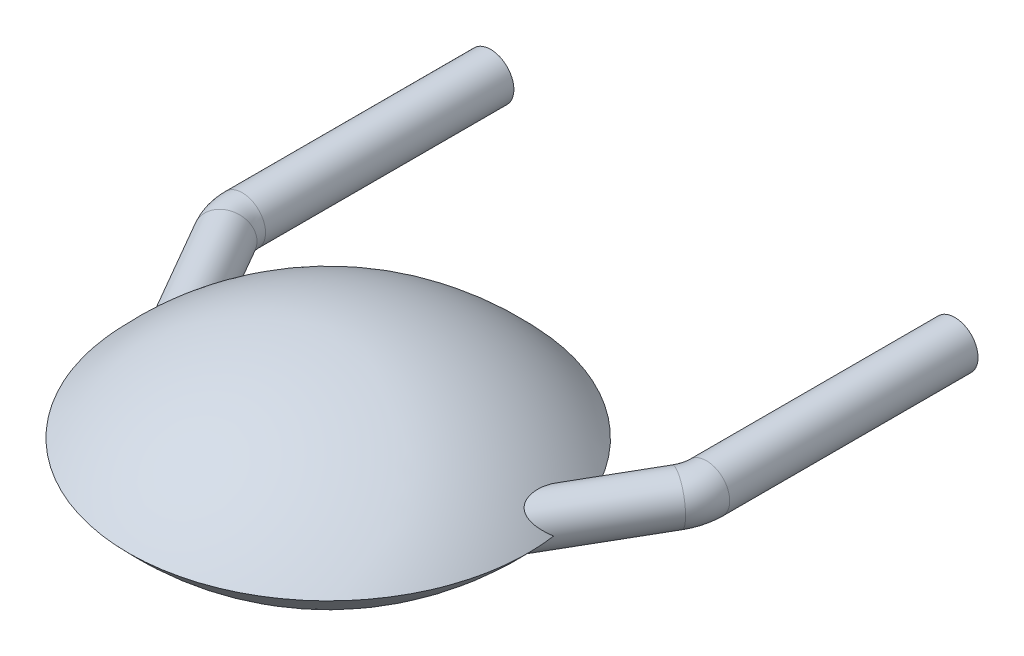
ISO-10303-21;
HEADER;
FILE_DESCRIPTION(('STEP AP214'),'2;1');
FILE_NAME('part.step','',(''),(''),'','','');
FILE_SCHEMA(('AUTOMOTIVE_DESIGN { 1 0 10303 214 1 1 1 1 }'));
ENDSEC;
DATA;
#1=APPLICATION_CONTEXT('core data for automotive mechanical design processes');
#2=APPLICATION_PROTOCOL_DEFINITION('international standard','automotive_design',2000,#1);
#3=PRODUCT_CONTEXT('',#1,'mechanical');
#4=PRODUCT('Part','Part','',(#3));
#5=PRODUCT_RELATED_PRODUCT_CATEGORY('part','',(#4));
#6=PRODUCT_DEFINITION_FORMATION('','',#4);
#7=PRODUCT_DEFINITION_CONTEXT('part definition',#1,'design');
#8=PRODUCT_DEFINITION('design','',#6,#7);
#9=PRODUCT_DEFINITION_SHAPE('','',#8);
#10=(LENGTH_UNIT() NAMED_UNIT(*) SI_UNIT(.MILLI.,.METRE.));
#11=(NAMED_UNIT(*) PLANE_ANGLE_UNIT() SI_UNIT($,.RADIAN.));
#12=(NAMED_UNIT(*) SI_UNIT($,.STERADIAN.) SOLID_ANGLE_UNIT());
#13=UNCERTAINTY_MEASURE_WITH_UNIT(LENGTH_MEASURE(1.E-05),#10,'distance_accuracy_value','');
#14=(GEOMETRIC_REPRESENTATION_CONTEXT(3) GLOBAL_UNCERTAINTY_ASSIGNED_CONTEXT((#13)) GLOBAL_UNIT_ASSIGNED_CONTEXT((#10,
#11,#12)) REPRESENTATION_CONTEXT('',''));
#15=CARTESIAN_POINT('',(0.,0.,0.));
#16=DIRECTION('',(0.,0.,1.));
#17=DIRECTION('',(1.,0.,0.));
#18=AXIS2_PLACEMENT_3D('',#15,#16,#17);
#19=CARTESIAN_POINT('',(23.,-31.25,-2.));
#20=DIRECTION('',(0.,0.,-1.));
#21=DIRECTION('',(-1.,0.,0.));
#22=AXIS2_PLACEMENT_3D('',#19,#20,#21);
#23=PLANE('',#22);
#24=CARTESIAN_POINT('',(23.,-31.,-2.));
#25=DIRECTION('',(0.,0.,-1.));
#26=DIRECTION('',(-1.,0.,0.));
#27=AXIS2_PLACEMENT_3D('',#24,#25,#26);
#28=CIRCLE('',#27,0.25);
#29=CARTESIAN_POINT('',(22.75,-31.,-2.));
#30=VERTEX_POINT('',#29);
#31=EDGE_CURVE('E20',#30,#30,#28,.F.);
#32=ORIENTED_EDGE('',*,*,#31,.F.);
#33=EDGE_LOOP('',(#32));
#34=FACE_BOUND('',#33,.T.);
#35=ADVANCED_FACE('F17',(#34),#23,.T.);
#36=CARTESIAN_POINT('',(28.,-30.75,-2.));
#37=DIRECTION('',(0.,0.,-1.));
#38=DIRECTION('',(-1.,0.,0.));
#39=AXIS2_PLACEMENT_3D('',#36,#37,#38);
#40=PLANE('',#39);
#41=CARTESIAN_POINT('',(28.,-31.,-2.));
#42=DIRECTION('',(0.,0.,-1.));
#43=DIRECTION('',(-1.,0.,0.));
#44=AXIS2_PLACEMENT_3D('',#41,#42,#43);
#45=CIRCLE('',#44,0.25);
#46=CARTESIAN_POINT('',(27.75,-31.,-2.));
#47=VERTEX_POINT('',#46);
#48=EDGE_CURVE('E109',#47,#47,#45,.F.);
#49=ORIENTED_EDGE('',*,*,#48,.F.);
#50=EDGE_LOOP('',(#49));
#51=FACE_BOUND('',#50,.T.);
#52=ADVANCED_FACE('F131',(#51),#40,.T.);
#53=CARTESIAN_POINT('',(23.,-31.,-2.));
#54=DIRECTION('',(0.,0.,-1.));
#55=DIRECTION('',(-1.,0.,0.));
#56=AXIS2_PLACEMENT_3D('',#53,#54,#55);
#57=CYLINDRICAL_SURFACE('',#56,0.25);
#58=CARTESIAN_POINT('',(23.,-31.,0.675));
#59=DIRECTION('',(0.,0.,1.));
#60=DIRECTION('',(0.,-1.,0.));
#61=AXIS2_PLACEMENT_3D('',#58,#59,#60);
#62=CIRCLE('',#61,0.25);
#63=CARTESIAN_POINT('',(23.,-31.25,0.675));
#64=VERTEX_POINT('',#63);
#65=EDGE_CURVE('E107',#64,#64,#62,.F.);
#66=ORIENTED_EDGE('',*,*,#65,.T.);
#67=EDGE_LOOP('',(#66));
#68=FACE_BOUND('',#67,.T.);
#69=ORIENTED_EDGE('',*,*,#31,.T.);
#70=EDGE_LOOP('',(#69));
#71=FACE_BOUND('',#70,.T.);
#72=ADVANCED_FACE('F128',(#68,#71),#57,.T.);
#73=CARTESIAN_POINT('',(28.,-31.,-2.));
#74=DIRECTION('',(0.,0.,-1.));
#75=DIRECTION('',(-1.,0.,0.));
#76=AXIS2_PLACEMENT_3D('',#73,#74,#75);
#77=CYLINDRICAL_SURFACE('',#76,0.25);
#78=CARTESIAN_POINT('',(28.,-31.,0.675));
#79=DIRECTION('',(0.,0.,1.));
#80=DIRECTION('',(0.,1.,0.));
#81=AXIS2_PLACEMENT_3D('',#78,#79,#80);
#82=CIRCLE('',#81,0.25);
#83=CARTESIAN_POINT('',(28.,-30.75,0.675));
#84=VERTEX_POINT('',#83);
#85=EDGE_CURVE('E91',#84,#84,#82,.F.);
#86=ORIENTED_EDGE('',*,*,#85,.T.);
#87=EDGE_LOOP('',(#86));
#88=FACE_BOUND('',#87,.T.);
#89=ORIENTED_EDGE('',*,*,#48,.T.);
#90=EDGE_LOOP('',(#89));
#91=FACE_BOUND('',#90,.T.);
#92=ADVANCED_FACE('F102',(#88,#91),#77,.T.);
#93=CARTESIAN_POINT('',(23.5,-31.,0.675));
#94=DIRECTION('',(0.,-1.,0.));
#95=DIRECTION('',(-1.,0.,0.));
#96=AXIS2_PLACEMENT_3D('',#93,#94,#95);
#97=TOROIDAL_SURFACE('',#96,0.5,0.25);
#98=ORIENTED_EDGE('',*,*,#65,.F.);
#99=EDGE_LOOP('',(#98));
#100=FACE_BOUND('',#99,.T.);
#101=CARTESIAN_POINT('',(23.066987298108,-31.,0.925));
#102=DIRECTION('',(-0.50000000000019,0.,-0.866025403784329));
#103=DIRECTION('',(-0.866025403784329,0.,0.50000000000019));
#104=AXIS2_PLACEMENT_3D('',#101,#102,#103);
#105=CIRCLE('',#104,0.25);
#106=CARTESIAN_POINT('',(22.8504809471619,-31.,1.05000000000005));
#107=VERTEX_POINT('',#106);
#108=EDGE_CURVE('E51',#107,#107,#105,.F.);
#109=ORIENTED_EDGE('',*,*,#108,.F.);
#110=EDGE_LOOP('',(#109));
#111=FACE_BOUND('',#110,.T.);
#112=ADVANCED_FACE('F98',(#100,#111),#97,.T.);
#113=CARTESIAN_POINT('',(27.5,-31.,0.675));
#114=DIRECTION('',(0.,1.,0.));
#115=DIRECTION('',(1.,0.,0.));
#116=AXIS2_PLACEMENT_3D('',#113,#114,#115);
#117=TOROIDAL_SURFACE('',#116,0.5,0.25);
#118=ORIENTED_EDGE('',*,*,#85,.F.);
#119=EDGE_LOOP('',(#118));
#120=FACE_BOUND('',#119,.T.);
#121=CARTESIAN_POINT('',(27.933012701892,-31.,0.925));
#122=DIRECTION('',(0.50000000000019,0.,-0.866025403784329));
#123=DIRECTION('',(-0.866025403784329,0.,-0.50000000000019));
#124=AXIS2_PLACEMENT_3D('',#121,#122,#123);
#125=CIRCLE('',#124,0.25);
#126=CARTESIAN_POINT('',(27.7165063509459,-31.,0.799999999999953));
#127=VERTEX_POINT('',#126);
#128=EDGE_CURVE('E50',#127,#127,#125,.F.);
#129=ORIENTED_EDGE('',*,*,#128,.F.);
#130=EDGE_LOOP('',(#129));
#131=FACE_BOUND('',#130,.T.);
#132=ADVANCED_FACE('F95',(#120,#131),#117,.T.);
#133=CARTESIAN_POINT('',(23.066987298108,-31.,0.925));
#134=DIRECTION('',(-0.50000000000019,0.,-0.866025403784329));
#135=DIRECTION('',(-0.866025403784329,0.,0.50000000000019));
#136=AXIS2_PLACEMENT_3D('',#133,#134,#135);
#137=CYLINDRICAL_SURFACE('',#136,0.25);
#138=CARTESIAN_POINT('',(23.5716838145196,-30.9999999999976,1.29916000882768));
#139=CARTESIAN_POINT('',(23.5774601766791,-30.9894434738567,1.30918239003158));
#140=CARTESIAN_POINT('',(23.5828108659559,-30.979220630234,1.3197681064508));
#141=CARTESIAN_POINT('',(23.592746279409,-30.9594575074187,1.34185503197646));
#142=CARTESIAN_POINT('',(23.5973324911761,-30.9499159237607,1.35335439724459));
#143=CARTESIAN_POINT('',(23.6100557173039,-30.9223783802168,1.38883785932953));
#144=CARTESIAN_POINT('',(23.6172195178193,-30.9053521436496,1.41392328078561));
#145=CARTESIAN_POINT('',(23.6325175301564,-30.8658849986947,1.47925777517468));
#146=CARTESIAN_POINT('',(23.6393178885034,-30.8450460864817,1.52077201062532));
#147=CARTESIAN_POINT('',(23.648996865941,-30.8089126909544,1.606785274381));
#148=CARTESIAN_POINT('',(23.6518563469068,-30.7936455273878,1.65129777503575));
#149=CARTESIAN_POINT('',(23.6531843613049,-30.7732269072097,1.72716896213327));
#150=CARTESIAN_POINT('',(23.6527829982239,-30.7664001156551,1.75806910985283));
#151=CARTESIAN_POINT('',(23.6497115700061,-30.7559549699982,1.8201960418939));
#152=CARTESIAN_POINT('',(23.6470539330635,-30.7523192612047,1.85142011308575));
#153=CARTESIAN_POINT('',(23.6408481774983,-30.7501275655035,1.89594436526071));
#154=CARTESIAN_POINT('',(23.6386633066418,-30.7498592545624,1.90935151637289));
#155=CARTESIAN_POINT('',(23.6334826955446,-30.7502843637098,1.93598562599727));
#156=CARTESIAN_POINT('',(23.6304880400283,-30.7509765023428,1.94921280087489));
#157=CARTESIAN_POINT('',(23.6233579054657,-30.7536028845258,1.9754936937176));
#158=CARTESIAN_POINT('',(23.6192041095652,-30.7555577956726,1.98854076660759));
#159=CARTESIAN_POINT('',(23.6093860597141,-30.7611359844498,2.01363177791909));
#160=CARTESIAN_POINT('',(23.6037319627004,-30.764748158157,2.02568177239951));
#161=CARTESIAN_POINT('',(23.5906440927888,-30.7740369705702,2.04715636895737));
#162=CARTESIAN_POINT('',(23.5833123718128,-30.7796024598458,2.05668146611759));
#163=CARTESIAN_POINT('',(23.5709404165737,-30.7895844616091,2.06818862762317));
#164=CARTESIAN_POINT('',(23.566559659586,-30.7932083971439,2.07157162682305));
#165=CARTESIAN_POINT('',(23.5574749771692,-30.8008975298499,2.07721472389281));
#166=CARTESIAN_POINT('',(23.5527710985493,-30.8049626631558,2.07947498402033));
#167=CARTESIAN_POINT('',(23.5393488607174,-30.8167883829376,2.08415878303395));
#168=CARTESIAN_POINT('',(23.5304507353933,-30.8248865705635,2.08524548427299));
#169=CARTESIAN_POINT('',(23.514876529338,-30.8394485216565,2.08443352459922));
#170=CARTESIAN_POINT('',(23.5081254694529,-30.8458992675567,2.08311259851742));
#171=CARTESIAN_POINT('',(23.4949570690765,-30.8587216171957,2.07907513862098));
#172=CARTESIAN_POINT('',(23.4885406124092,-30.8650929805379,2.07635509634145));
#173=CARTESIAN_POINT('',(23.4709949416565,-30.8828308934959,2.0672602591048));
#174=CARTESIAN_POINT('',(23.4603066752815,-30.8940178539172,2.05971627682202));
#175=CARTESIAN_POINT('',(23.4400571285355,-30.9158911760848,2.04262047432083));
#176=CARTESIAN_POINT('',(23.4305011653482,-30.9265750441903,2.03305972512755));
#177=CARTESIAN_POINT('',(23.4119101946357,-30.9480591366764,2.01204619889605));
#178=CARTESIAN_POINT('',(23.4029315574867,-30.9588342403125,2.00051892560664));
#179=CARTESIAN_POINT('',(23.386113862992,-30.979795776747,1.97653612190643));
#180=CARTESIAN_POINT('',(23.3782602511313,-30.9899884540942,1.96409635781548));
#181=CARTESIAN_POINT('',(23.3708496305074,-30.9999999999975,1.95130499822168));
#182=B_SPLINE_CURVE_WITH_KNOTS('',3,(#138,#139,#140,#141,#142,#143,#144,#145,#146,#147,#148,
#149,#150,#151,#152,#153,#154,#155,#156,#157,#158,#159,#160,#161,#162,#163,#164,#165,#166,#167,
#168,#169,#170,#171,#172,#173,#174,#175,#176,#177,#178,#179,#180,#181),.UNSPECIFIED.,.F.,.F.,(4,
2,2,2,2,2,2,2,2,2,2,2,2,2,2,2,2,2,2,2,2,4),(0.,0.0469297268758645,0.093767039666413,
0.186918712773409,0.327066799423388,0.467893118612538,0.562667830135627,0.656923857782774,
0.697641576665213,0.738305021166334,0.779651464183061,0.820724836454615,0.859763250813787,
0.879498823201881,0.899231542585361,0.93486936662997,0.963041108101063,0.991283840774755,
1.04264171008501,1.09423192015922,1.14862039353849,1.20222527925137),.UNSPECIFIED.);
#183=CARTESIAN_POINT('',(23.5716838145206,-30.9999999999963,1.29916000882837));
#184=VERTEX_POINT('',#183);
#185=CARTESIAN_POINT('',(23.3708496305082,-30.9999999999961,1.95130499822308));
#186=VERTEX_POINT('',#185);
#187=EDGE_CURVE('E43',#184,#186,#182,.T.);
#188=ORIENTED_EDGE('',*,*,#187,.F.);
#189=CARTESIAN_POINT('',(23.370849630509,-30.9999999999947,1.95130499822448));
#190=CARTESIAN_POINT('',(23.3762704914257,-31.0073260291793,1.9606834434227));
#191=CARTESIAN_POINT('',(23.3819319959003,-31.0147507090038,1.96985535314893));
#192=CARTESIAN_POINT('',(23.3937931162556,-31.0298469541461,1.9877033124474));
#193=CARTESIAN_POINT('',(23.3999946721842,-31.0375193415481,1.99637737157592));
#194=CARTESIAN_POINT('',(23.4130203687763,-31.0531874857876,2.01316206446949));
#195=CARTESIAN_POINT('',(23.4198503466259,-31.0611857867682,2.02126585051422));
#196=CARTESIAN_POINT('',(23.4341222531439,-31.0774518786172,2.03659777519217));
#197=CARTESIAN_POINT('',(23.4415632102891,-31.0857192294964,2.04382726046125));
#198=CARTESIAN_POINT('',(23.4549355110937,-31.1001906211907,2.05522258355374));
#199=CARTESIAN_POINT('',(23.4607007866916,-31.106319019691,2.05967743562222));
#200=CARTESIAN_POINT('',(23.4726135007689,-31.1187473850408,2.06778114159423));
#201=CARTESIAN_POINT('',(23.4787609569798,-31.1250473598431,2.07142995806566));
#202=CARTESIAN_POINT('',(23.4915175305904,-31.1378738463305,2.07767290536923));
#203=CARTESIAN_POINT('',(23.4981309782167,-31.1444020864909,2.08025500776712));
#204=CARTESIAN_POINT('',(23.5117121637186,-31.1575380086699,2.08386891955295));
#205=CARTESIAN_POINT('',(23.5186791054384,-31.1641454886267,2.08490406565989));
#206=CARTESIAN_POINT('',(23.5303258137975,-31.1749471062334,2.08489207609271));
#207=CARTESIAN_POINT('',(23.534962814526,-31.1791851761192,2.0844415263007));
#208=CARTESIAN_POINT('',(23.5441810682798,-31.1874756861167,2.08252149191467));
#209=CARTESIAN_POINT('',(23.5487624310105,-31.1915285603762,2.08105453613206));
#210=CARTESIAN_POINT('',(23.5577541398852,-31.1993395264546,2.07704687319156));
#211=CARTESIAN_POINT('',(23.5621634373595,-31.2030959211874,2.07450045094904));
#212=CARTESIAN_POINT('',(23.5706404610701,-31.2101671943634,2.0684208546806));
#213=CARTESIAN_POINT('',(23.5747079985558,-31.2134818294119,2.06488713998262));
#214=CARTESIAN_POINT('',(23.5875743622429,-31.2237055414432,2.05171666652548));
#215=CARTESIAN_POINT('',(23.595407967582,-31.229478145455,2.04024777326555));
#216=CARTESIAN_POINT('',(23.6073704709567,-31.2375800941341,2.01797260740955));
#217=CARTESIAN_POINT('',(23.6119298123824,-31.2403731203619,2.00751401016957));
#218=CARTESIAN_POINT('',(23.6199961188454,-31.2447962626931,1.98594265330505));
#219=CARTESIAN_POINT('',(23.6235008617729,-31.2464239331241,1.97482857061149));
#220=CARTESIAN_POINT('',(23.6288458552504,-31.2484350007752,1.95535341428606));
#221=CARTESIAN_POINT('',(23.6308797840109,-31.2490360696796,1.94706260744734));
#222=CARTESIAN_POINT('',(23.6345820785632,-31.2498179064455,1.93039798509434));
#223=CARTESIAN_POINT('',(23.6362511597378,-31.2499995036113,1.92202436629215));
#224=CARTESIAN_POINT('',(23.6407460155134,-31.2500009733514,1.89715005197041));
#225=CARTESIAN_POINT('',(23.6431422171635,-31.2493056154992,1.88057137589999));
#226=CARTESIAN_POINT('',(23.6470587271412,-31.246792810136,1.84739019654105));
#227=CARTESIAN_POINT('',(23.648577981277,-31.2449740175391,1.83078768852717));
#228=CARTESIAN_POINT('',(23.6520947928669,-31.2380508647447,1.78089673990654));
#229=CARTESIAN_POINT('',(23.6530192615169,-31.231484398354,1.74773329288159));
#230=CARTESIAN_POINT('',(23.6526212130362,-31.2114108884292,1.66726885221905));
#231=CARTESIAN_POINT('',(23.6500795927319,-31.1961036577616,1.62042874138108));
#232=CARTESIAN_POINT('',(23.640700633774,-31.1593664707263,1.52996486839545));
#233=CARTESIAN_POINT('',(23.633890159786,-31.1379752584451,1.48632288414947));
#234=CARTESIAN_POINT('',(23.6183420229703,-31.0973666263978,1.41804752079719));
#235=CARTESIAN_POINT('',(23.6110711712103,-31.0799288542045,1.39203616028012));
#236=CARTESIAN_POINT('',(23.598072975853,-31.0516392810598,1.35526053810852));
#237=CARTESIAN_POINT('',(23.5933730591969,-31.041818863107,1.34334086765456));
#238=CARTESIAN_POINT('',(23.5831623816106,-31.0214520499175,1.32046622093208));
#239=CARTESIAN_POINT('',(23.5776499369343,-31.0109041719652,1.30951332526754));
#240=CARTESIAN_POINT('',(23.5716838145214,-30.9999999999956,1.29916000883069));
#241=B_SPLINE_CURVE_WITH_KNOTS('',3,(#189,#190,#191,#192,#193,#194,#195,#196,#197,#198,#199,
#200,#201,#202,#203,#204,#205,#206,#207,#208,#209,#210,#211,#212,#213,#214,#215,#216,#217,#218,
#219,#220,#221,#222,#223,#224,#225,#226,#227,#228,#229,#230,#231,#232,#233,#234,#235,#236,#237,
#238,#239,#240),.UNSPECIFIED.,.F.,.F.,(4,2,2,2,2,2,2,2,2,2,2,2,2,2,2,2,2,2,2,2,2,2,2,2,2,4),(0.,
0.0392376098810692,0.0786224989494974,0.118419631433026,0.158154664136992,0.186683761257875,
0.215214182984627,0.244058071956325,0.272839655632403,0.291661969838005,0.31043762162438,
0.329313945017611,0.348200626003105,0.392399981500024,0.42752172097679,0.462716954291726,
0.488373172236839,0.513978623736206,0.56418746626216,0.614456540558949,0.715621079863322,
0.862990207242744,1.00944109920643,1.10555865709927,1.15392973094745,1.20240248798468),.UNSPECIFIED.);
#242=EDGE_CURVE('E53',#186,#184,#241,.T.);
#243=ORIENTED_EDGE('',*,*,#242,.F.);
#244=EDGE_LOOP('',(#188,#243));
#245=FACE_BOUND('',#244,.T.);
#246=ORIENTED_EDGE('',*,*,#108,.T.);
#247=EDGE_LOOP('',(#246));
#248=FACE_BOUND('',#247,.T.);
#249=ADVANCED_FACE('F54',(#245,#248),#137,.T.);
#250=CARTESIAN_POINT('',(25.5,-32.95789473684,2.25));
#251=DIRECTION('',(1.,0.,0.));
#252=DIRECTION('',(0.,0.,-1.));
#253=AXIS2_PLACEMENT_3D('',#250,#251,#252);
#254=SPHERICAL_SURFACE('',#253,2.907894736842);
#255=CARTESIAN_POINT('',(27.6291503694904,-30.999999999995,1.95130499822226));
#256=CARTESIAN_POINT('',(27.6360854649517,-30.999999999995,2.00072178155626));
#257=CARTESIAN_POINT('',(27.6412947100438,-30.999999999995,2.05037691776354));
#258=CARTESIAN_POINT('',(27.6482551419081,-30.999999999995,2.15001990106865));
#259=CARTESIAN_POINT('',(27.6500000148116,-30.999999999995,2.20000818935141));
#260=CARTESIAN_POINT('',(27.6499999820985,-30.999999999995,2.31040000216905));
#261=CARTESIAN_POINT('',(27.6474528778951,-30.999999999995,2.37080514608428));
#262=CARTESIAN_POINT('',(27.6372822926077,-30.999999999995,2.49119557091687));
#263=CARTESIAN_POINT('',(27.6296577482943,-30.999999999995,2.55118076123576));
#264=CARTESIAN_POINT('',(27.6093760094947,-30.999999999995,2.67034040925088));
#265=CARTESIAN_POINT('',(27.5967154405601,-30.999999999995,2.72951429576506));
#266=CARTESIAN_POINT('',(27.566448502121,-30.999999999995,2.84662045274802));
#267=CARTESIAN_POINT('',(27.5488379996646,-30.999999999995,2.90455164193352));
#268=CARTESIAN_POINT('',(27.4888066101061,-30.999999999995,3.07566359722195));
#269=CARTESIAN_POINT('',(27.4391461458836,-30.999999999995,3.18639452014764));
#270=CARTESIAN_POINT('',(27.321913939087,-30.999999999995,3.39793439756679));
#271=CARTESIAN_POINT('',(27.2543416284877,-30.999999999995,3.49874303726314));
#272=CARTESIAN_POINT('',(27.1410862332779,-30.999999999995,3.64032609454379));
#273=CARTESIAN_POINT('',(27.1013209969466,-30.999999999995,3.68594277166785));
#274=CARTESIAN_POINT('',(27.0181202621447,-30.999999999995,3.77363257663878));
#275=CARTESIAN_POINT('',(26.9746883352699,-30.999999999995,3.8157090748565));
#276=CARTESIAN_POINT('',(26.8844159765172,-30.999999999995,3.89606964333075));
#277=CARTESIAN_POINT('',(26.8375742043892,-30.999999999995,3.93435220825683));
#278=CARTESIAN_POINT('',(26.7408365357378,-30.999999999995,4.00683916359972));
#279=CARTESIAN_POINT('',(26.6909399352486,-30.999999999995,4.04104260861514));
#280=CARTESIAN_POINT('',(26.5372094740422,-30.999999999995,4.1371311946208));
#281=CARTESIAN_POINT('',(26.4292416884469,-30.999999999995,4.1925774584338));
#282=CARTESIAN_POINT('',(26.2055872122194,-30.999999999995,4.28452380574253));
#283=CARTESIAN_POINT('',(26.089900518999,-30.999999999995,4.32102388288566));
#284=CARTESIAN_POINT('',(25.8540260639195,-30.999999999995,4.37409263588143));
#285=CARTESIAN_POINT('',(25.7338383069659,-30.999999999995,4.39066133345576));
#286=CARTESIAN_POINT('',(25.4923909265295,-30.999999999995,4.40338341874196));
#287=CARTESIAN_POINT('',(25.3711313010702,-30.999999999995,4.3995367688007));
#288=CARTESIAN_POINT('',(25.1309772429793,-30.999999999995,4.37154085845372));
#289=CARTESIAN_POINT('',(25.0120828222607,-30.999999999995,4.34739149581385));
#290=CARTESIAN_POINT('',(24.780037571144,-30.999999999995,4.2794749735449));
#291=CARTESIAN_POINT('',(24.6668866723259,-30.999999999995,4.2357080476719));
#292=CARTESIAN_POINT('',(24.4495393629724,-30.999999999995,4.12979956704723));
#293=CARTESIAN_POINT('',(24.3453428885282,-30.999999999995,4.06765814345071));
#294=CARTESIAN_POINT('',(24.1488587758445,-30.999999999995,3.92676236660838));
#295=CARTESIAN_POINT('',(24.056571449582,-30.999999999995,3.8480075782943));
#296=CARTESIAN_POINT('',(23.8865296824143,-30.999999999995,3.67612358796471));
#297=CARTESIAN_POINT('',(23.80877507096,-30.999999999995,3.58299455466207));
#298=CARTESIAN_POINT('',(23.6700047183838,-30.999999999995,3.38500225004167));
#299=CARTESIAN_POINT('',(23.6089889317679,-30.999999999995,3.28013901061711));
#300=CARTESIAN_POINT('',(23.5054191814903,-30.999999999995,3.06164699532974));
#301=CARTESIAN_POINT('',(23.4628684879494,-30.999999999995,2.9480166710319));
#302=CARTESIAN_POINT('',(23.3974631101735,-30.999999999995,2.71523116645579));
#303=CARTESIAN_POINT('',(23.3746015125594,-30.999999999995,2.59607794091807));
#304=CARTESIAN_POINT('',(23.3526806754343,-30.999999999995,2.38866025304142));
#305=CARTESIAN_POINT('',(23.3488175679652,-30.999999999995,2.30087287442412));
#306=CARTESIAN_POINT('',(23.3518113253251,-30.999999999995,2.12558766346632));
#307=CARTESIAN_POINT('',(23.3586552646342,-30.999999999995,2.03808960959342));
#308=CARTESIAN_POINT('',(23.3708496305096,-30.999999999995,1.95130499822225));
#309=B_SPLINE_CURVE_WITH_KNOTS('',3,(#255,#256,#257,#258,#259,#260,#261,#262,#263,#264,#265,
#266,#267,#268,#269,#270,#271,#272,#273,#274,#275,#276,#277,#278,#279,#280,#281,#282,#283,#284,
#285,#286,#287,#288,#289,#290,#291,#292,#293,#294,#295,#296,#297,#298,#299,#300,#301,#302,#303,
#304,#305,#306,#307,#308),.UNSPECIFIED.,.F.,.F.,(4,2,2,2,2,2,2,2,2,2,2,2,2,2,2,2,2,2,2,2,2,2,2,
2,2,2,4),(0.,0.14966557010518,0.299603658416562,0.480758546421937,0.661951380670578,
0.843265830417116,1.02473212085861,1.38696826277253,1.74921589338853,1.93058272481644,
2.11177488757954,2.29303865707325,2.47434435604159,2.83658618157754,3.19882812857214,
3.56106968078646,3.92331190110273,4.28555594549763,4.64779567363321,5.01003281620375,
5.37227944616333,5.73452182469817,6.0967632186939,6.4590687385616,6.82124699114457,
7.08424045667608,7.34691668206033),.UNSPECIFIED.);
#310=CARTESIAN_POINT('',(27.6291503694915,-30.9999999999962,1.95130499822197));
#311=VERTEX_POINT('',#310);
#312=EDGE_CURVE('E47',#311,#186,#309,.T.);
#313=ORIENTED_EDGE('',*,*,#312,.F.);
#314=CARTESIAN_POINT('',(27.4283161854804,-30.9999999999976,1.29916000882767));
#315=CARTESIAN_POINT('',(27.4225367367219,-30.9894378012706,1.30918775479953));
#316=CARTESIAN_POINT('',(27.4171833642108,-30.9792095869943,1.31977953624077));
#317=CARTESIAN_POINT('',(27.4072433432266,-30.9594364253405,1.34187951293301));
#318=CARTESIAN_POINT('',(27.4026552076923,-30.9498901738722,1.35338586509603));
#319=CARTESIAN_POINT('',(27.3899365306303,-30.9223598594399,1.38886513524478));
#320=CARTESIAN_POINT('',(27.382777446917,-30.9053439291383,1.41393677926469));
#321=CARTESIAN_POINT('',(27.3674872762009,-30.8658979760822,1.47923644257929));
#322=CARTESIAN_POINT('',(27.3606877933973,-30.8450671568642,1.52072985852239));
#323=CARTESIAN_POINT('',(27.3510085053397,-30.8089328868643,1.60672915534258));
#324=CARTESIAN_POINT('',(27.3481524004882,-30.7936632600436,1.65125157799293));
#325=CARTESIAN_POINT('',(27.3467204797612,-30.7718553772052,1.73224982740947));
#326=CARTESIAN_POINT('',(27.3473540654543,-30.7641440487118,1.76838901009808));
#327=CARTESIAN_POINT('',(27.3507589840729,-30.7559747782892,1.82288267595532));
#328=CARTESIAN_POINT('',(27.3522982715378,-30.7538187868719,1.84106299091954));
#329=CARTESIAN_POINT('',(27.3564040345127,-30.7508316744757,1.87740836449139));
#330=CARTESIAN_POINT('',(27.3589692491575,-30.7499989334458,1.8955734144991));
#331=CARTESIAN_POINT('',(27.3649209097095,-30.7500008797149,1.92851130551844));
#332=CARTESIAN_POINT('',(27.3680847738023,-30.750569024397,1.94332094901496));
#333=CARTESIAN_POINT('',(27.3756868449457,-30.7531635169215,1.97244032394874));
#334=CARTESIAN_POINT('',(27.3801211197323,-30.7551853937842,1.98675144744156));
#335=CARTESIAN_POINT('',(27.391257774071,-30.7614905055746,2.01534402663906));
#336=CARTESIAN_POINT('',(27.3980991138998,-30.7659244397394,2.02955088312044));
#337=CARTESIAN_POINT('',(27.4097766436276,-30.7744306147626,2.04718506770339));
#338=CARTESIAN_POINT('',(27.4134172254309,-30.7771750690502,2.05202969437097));
#339=CARTESIAN_POINT('',(27.4211833252477,-30.7832242736697,2.06090102590305));
#340=CARTESIAN_POINT('',(27.4253075260726,-30.7865275124867,2.06492987451531));
#341=CARTESIAN_POINT('',(27.4340107355744,-30.7936841666099,2.0719793008098));
#342=CARTESIAN_POINT('',(27.438593126168,-30.7975417813901,2.07499153404898));
#343=CARTESIAN_POINT('',(27.448024321296,-30.8056546020815,2.07982321470773));
#344=CARTESIAN_POINT('',(27.4528732163516,-30.8099099434331,2.08164225409802));
#345=CARTESIAN_POINT('',(27.4664884240337,-30.8220786197806,2.08505919714016));
#346=CARTESIAN_POINT('',(27.4753510643296,-30.8302487276767,2.08537021709484));
#347=CARTESIAN_POINT('',(27.4914062985412,-30.8454372589026,2.08331736254665));
#348=CARTESIAN_POINT('',(27.4986610965689,-30.8524597613513,2.08131495929587));
#349=CARTESIAN_POINT('',(27.5127474207038,-30.8663711818493,2.07583229883641));
#350=CARTESIAN_POINT('',(27.5195776816429,-30.8732596621743,2.07234784627326));
#351=CARTESIAN_POINT('',(27.5386295948923,-30.8928486168647,2.06078772969878));
#352=CARTESIAN_POINT('',(27.5502766643549,-30.9053009689064,2.05137709154917));
#353=CARTESIAN_POINT('',(27.572189639237,-30.9295849811307,2.0304061925654));
#354=CARTESIAN_POINT('',(27.5824509533722,-30.9414145024185,2.01883907428008));
#355=CARTESIAN_POINT('',(27.5988776614797,-30.9610953684624,1.99792317522195));
#356=CARTESIAN_POINT('',(27.6053527915499,-30.9690823059715,1.98893961530066));
#357=CARTESIAN_POINT('',(27.6176843543501,-30.9847464092161,1.97047604813943));
#358=CARTESIAN_POINT('',(27.6235458455716,-30.9924257208108,1.96100125587697));
#359=CARTESIAN_POINT('',(27.6291503694926,-30.9999999999975,1.95130499822168));
#360=B_SPLINE_CURVE_WITH_KNOTS('',3,(#314,#315,#316,#317,#318,#319,#320,#321,#322,#323,#324,
#325,#326,#327,#328,#329,#330,#331,#332,#333,#334,#335,#336,#337,#338,#339,#340,#341,#342,#343,
#344,#345,#346,#347,#348,#349,#350,#351,#352,#353,#354,#355,#356,#357,#358,#359),.UNSPECIFIED.,
.F.,.F.,(4,2,2,2,2,2,2,2,2,2,2,2,2,2,2,2,2,2,2,2,2,2,4),(0.,0.0469550955786165,
0.0938178539367406,0.186918795809335,0.32698690034998,0.467893227542305,0.578395675213932,
0.633456561754142,0.688449985350815,0.733809752707624,0.779030608753974,0.827469822386033,
0.847352455144506,0.867182141004547,0.887170841964182,0.907166374780203,0.942808645315066,
0.973556249744349,1.00439147929431,1.06249899681845,1.12079454519183,1.16172950792808,
1.20229485712044),.UNSPECIFIED.);
#361=CARTESIAN_POINT('',(27.4283161854795,-30.9999999999966,1.29916000882918));
#362=VERTEX_POINT('',#361);
#363=EDGE_CURVE('E32',#362,#311,#360,.T.);
#364=ORIENTED_EDGE('',*,*,#363,.F.);
#365=CARTESIAN_POINT('',(23.5716838145216,-30.999999999995,1.29916000882905));
#366=CARTESIAN_POINT('',(23.5984352472794,-30.999999999995,1.24490872742821));
#367=CARTESIAN_POINT('',(23.6274639997582,-30.999999999995,1.19181271570516));
#368=CARTESIAN_POINT('',(23.6898870200672,-30.999999999995,1.08825564381542));
#369=CARTESIAN_POINT('',(23.7232810789746,-30.999999999995,1.03779445770803));
#370=CARTESIAN_POINT('',(23.8296179194349,-30.999999999995,0.890999186955336));
#371=CARTESIAN_POINT('',(23.9088023938753,-30.999999999995,0.799077333082788));
#372=CARTESIAN_POINT('',(24.0814751083044,-30.999999999995,0.62983645693932));
#373=CARTESIAN_POINT('',(24.1749699836618,-30.999999999995,0.552524246140121));
#374=CARTESIAN_POINT('',(24.3736094057891,-30.999999999995,0.414695404719123));
#375=CARTESIAN_POINT('',(24.4787517248396,-30.9999999999949,0.354175570079122));
#376=CARTESIAN_POINT('',(24.6976859147266,-30.9999999999949,0.251646683827));
#377=CARTESIAN_POINT('',(24.8114779946438,-30.999999999995,0.209638079832753));
#378=CARTESIAN_POINT('',(25.0445829659172,-30.999999999995,0.145316266877984));
#379=CARTESIAN_POINT('',(25.1638966422672,-30.999999999995,0.123005867478894));
#380=CARTESIAN_POINT('',(25.3442788382346,-30.999999999995,0.104790758021248));
#381=CARTESIAN_POINT('',(25.4046708753339,-30.999999999995,0.101262778938733));
#382=CARTESIAN_POINT('',(25.5255389886632,-30.999999999995,0.0993036142395337));
#383=CARTESIAN_POINT('',(25.586015042279,-30.999999999995,0.100871252428406));
#384=CARTESIAN_POINT('',(25.7065940135736,-30.999999999995,0.109096120566263));
#385=CARTESIAN_POINT('',(25.7666970780009,-30.999999999995,0.115751201558408));
#386=CARTESIAN_POINT('',(25.8861740842489,-30.999999999995,0.134100653176694));
#387=CARTESIAN_POINT('',(25.9455472688491,-30.999999999995,0.145799866526584));
#388=CARTESIAN_POINT('',(26.1217926694556,-30.999999999995,0.188338670986202));
#389=CARTESIAN_POINT('',(26.2369532810684,-30.999999999995,0.226630673647842));
#390=CARTESIAN_POINT('',(26.4591950931754,-30.999999999995,0.322030225172089));
#391=CARTESIAN_POINT('',(26.5662764645177,-30.999999999995,0.379137376022022));
#392=CARTESIAN_POINT('',(26.718529049792,-30.999999999995,0.477611751344461));
#393=CARTESIAN_POINT('',(26.7679227845144,-30.999999999995,0.512606783015826));
#394=CARTESIAN_POINT('',(26.8635557264742,-30.999999999995,0.586610828026253));
#395=CARTESIAN_POINT('',(26.9097976613404,-30.999999999995,0.625616295385319));
#396=CARTESIAN_POINT('',(26.9988192198671,-30.999999999995,0.707374415398626));
#397=CARTESIAN_POINT('',(27.0415995394005,-30.999999999995,0.750126311307635));
#398=CARTESIAN_POINT('',(27.1234051790148,-30.999999999995,0.839075665428152));
#399=CARTESIAN_POINT('',(27.1624307446735,-30.999999999995,0.885272897947787));
#400=CARTESIAN_POINT('',(27.2436301052124,-30.999999999995,0.99005858324182));
#401=CARTESIAN_POINT('',(27.2849479491429,-30.999999999995,1.0493132026875));
#402=CARTESIAN_POINT('',(27.3613668709734,-30.999999999995,1.17156674998612));
#403=CARTESIAN_POINT('',(27.3964781452762,-30.999999999995,1.23455930521064));
#404=CARTESIAN_POINT('',(27.4283161854784,-30.999999999995,1.29916000882905));
#405=B_SPLINE_CURVE_WITH_KNOTS('',3,(#365,#366,#367,#368,#369,#370,#371,#372,#373,#374,#375,
#376,#377,#378,#379,#380,#381,#382,#383,#384,#385,#386,#387,#388,#389,#390,#391,#392,#393,#394,
#395,#396,#397,#398,#399,#400,#401,#402,#403,#404),.UNSPECIFIED.,.F.,.F.,(4,2,2,2,2,2,2,2,2,2,2,
2,2,2,2,2,2,2,2,4),(0.,0.181353545994017,0.362698415612238,0.724806475414669,1.08708294700132,
1.44929024792175,1.81150630685343,2.17377402043932,2.35508219842909,2.53634852898113,
2.71753833416645,2.8989024830923,3.26114820055583,3.62338625562258,3.80480889211245,
3.98607247426457,4.16729952681025,4.34851471821947,4.56485453297437,4.78083556429408),.UNSPECIFIED.);
#406=EDGE_CURVE('E25',#184,#362,#405,.T.);
#407=ORIENTED_EDGE('',*,*,#406,.F.);
#408=ORIENTED_EDGE('',*,*,#187,.T.);
#409=EDGE_LOOP('',(#313,#364,#407,#408));
#410=FACE_BOUND('',#409,.T.);
#411=ADVANCED_FACE('F45',(#410),#254,.T.);
#412=CARTESIAN_POINT('',(27.933012701892,-31.,0.925));
#413=DIRECTION('',(0.50000000000019,0.,-0.866025403784329));
#414=DIRECTION('',(-0.866025403784329,0.,-0.50000000000019));
#415=AXIS2_PLACEMENT_3D('',#412,#413,#414);
#416=CYLINDRICAL_SURFACE('',#415,0.25);
#417=ORIENTED_EDGE('',*,*,#363,.T.);
#418=CARTESIAN_POINT('',(27.4283161854786,-30.9999999999956,1.29916000883068));
#419=CARTESIAN_POINT('',(27.422539823319,-31.0105565261364,1.30918239003421));
#420=CARTESIAN_POINT('',(27.4171891340421,-31.0207793697589,1.31976810645305));
#421=CARTESIAN_POINT('',(27.4072537205888,-31.0405424925742,1.34185503197797));
#422=CARTESIAN_POINT('',(27.4026675088215,-31.050084076232,1.35335439724573));
#423=CARTESIAN_POINT('',(27.3899442826933,-31.0776216197758,1.38883785932955));
#424=CARTESIAN_POINT('',(27.3827804821776,-31.0946478563429,1.41392328078487));
#425=CARTESIAN_POINT('',(27.3674824698396,-31.1341150012983,1.47925777517279));
#426=CARTESIAN_POINT('',(27.3606821114919,-31.1549539135117,1.52077201062312));
#427=CARTESIAN_POINT('',(27.351003134053,-31.19108730904,1.60678527437831));
#428=CARTESIAN_POINT('',(27.3481436530865,-31.2063544726072,1.65129777503289));
#429=CARTESIAN_POINT('',(27.346815638687,-31.2267730927871,1.72716896213316));
#430=CARTESIAN_POINT('',(27.3472170017677,-31.2335998843427,1.75806910985569));
#431=CARTESIAN_POINT('',(27.3502884299849,-31.2440450300011,1.82019604190283));
#432=CARTESIAN_POINT('',(27.3529460669274,-31.2476807387952,1.85142011309778));
#433=CARTESIAN_POINT('',(27.3591518224925,-31.2498724344965,1.89594436527437));
#434=CARTESIAN_POINT('',(27.3613366933486,-31.2501407454375,1.90935151638512));
#435=CARTESIAN_POINT('',(27.3665173044448,-31.2497156362904,1.93598562600669));
#436=CARTESIAN_POINT('',(27.3695119599606,-31.2490234976577,1.94921280088293));
#437=CARTESIAN_POINT('',(27.3766420945217,-31.2463971154756,1.97549369372291));
#438=CARTESIAN_POINT('',(27.3807958904213,-31.2444422043295,1.98854076661155));
#439=CARTESIAN_POINT('',(27.3906139402699,-31.2388640155542,2.01363177792089));
#440=CARTESIAN_POINT('',(27.3962680372821,-31.2352518418482,2.02568177240049));
#441=CARTESIAN_POINT('',(27.4093559071913,-31.2259630294374,2.0471563689598));
#442=CARTESIAN_POINT('',(27.4166876281667,-31.2203975401627,2.05668146612192));
#443=CARTESIAN_POINT('',(27.4290595834054,-31.2104155384002,2.0681886276306));
#444=CARTESIAN_POINT('',(27.433440340393,-31.2067916028656,2.07157162683159));
#445=CARTESIAN_POINT('',(27.4425250228098,-31.1991024701599,2.07721472390349));
#446=CARTESIAN_POINT('',(27.4472289014298,-31.195037336854,2.07947498403205));
#447=CARTESIAN_POINT('',(27.4606511392617,-31.1832116170727,2.08415878304816));
#448=CARTESIAN_POINT('',(27.4695492645858,-31.175113429447,2.08524548428864));
#449=CARTESIAN_POINT('',(27.4851234706403,-31.1605514783551,2.08443352461707));
#450=CARTESIAN_POINT('',(27.4918745305245,-31.1541007324561,2.08311259853644));
#451=CARTESIAN_POINT('',(27.5050429308993,-31.1412783828191,2.07907513864248));
#452=CARTESIAN_POINT('',(27.5114593875658,-31.134907019478,2.07635509636427));
#453=CARTESIAN_POINT('',(27.5290050583159,-31.1171691065234,2.06726025913183));
#454=CARTESIAN_POINT('',(27.5396933246893,-31.1059821461045,2.05971627685221));
#455=CARTESIAN_POINT('',(27.5599428714324,-31.0841088239412,2.04262047435759));
#456=CARTESIAN_POINT('',(27.5694988346186,-31.0734249558379,2.03305972516773));
#457=CARTESIAN_POINT('',(27.5880898053368,-31.0519408633468,2.01204619893448));
#458=CARTESIAN_POINT('',(27.597068442492,-31.041165759704,2.00051892563867));
#459=CARTESIAN_POINT('',(27.6138861369975,-31.0202042232568,1.97653612192453));
#460=CARTESIAN_POINT('',(27.6217397488629,-31.0100115459037,1.96409635782608));
#461=CARTESIAN_POINT('',(27.629150369491,-30.9999999999947,1.95130499822448));
#462=B_SPLINE_CURVE_WITH_KNOTS('',3,(#418,#419,#420,#421,#422,#423,#424,#425,#426,#427,#428,
#429,#430,#431,#432,#433,#434,#435,#436,#437,#438,#439,#440,#441,#442,#443,#444,#445,#446,#447,
#448,#449,#450,#451,#452,#453,#454,#455,#456,#457,#458,#459,#460,#461),.UNSPECIFIED.,.F.,.F.,(4,
2,2,2,2,2,2,2,2,2,2,2,2,2,2,2,2,2,2,2,2,4),(0.,0.0469297268750505,0.0937670396647847,
0.186918712770062,0.327066799420094,0.467893118609421,0.562667830141827,0.656923857798223,
0.697641576676234,0.738305021172952,0.77965146418478,0.820724836451689,0.859763250812991,
0.879498823202248,0.899231542586872,0.934869366631468,0.963041108097913,0.991283840766919,
1.0426417100655,1.09423192012812,1.14862039354041,1.20222527928507),.UNSPECIFIED.);
#463=EDGE_CURVE('E11',#362,#311,#462,.T.);
#464=ORIENTED_EDGE('',*,*,#463,.F.);
#465=EDGE_LOOP('',(#417,#464));
#466=FACE_BOUND('',#465,.T.);
#467=ORIENTED_EDGE('',*,*,#128,.T.);
#468=EDGE_LOOP('',(#467));
#469=FACE_BOUND('',#468,.T.);
#470=ADVANCED_FACE('F80',(#466,#469),#416,.T.);
#471=CARTESIAN_POINT('',(25.5,-29.04210526315,2.25));
#472=DIRECTION('',(1.,0.,0.));
#473=DIRECTION('',(0.,0.,-1.));
#474=AXIS2_PLACEMENT_3D('',#471,#472,#473);
#475=SPHERICAL_SURFACE('',#474,2.907894736842);
#476=ORIENTED_EDGE('',*,*,#463,.T.);
#477=ORIENTED_EDGE('',*,*,#312,.T.);
#478=ORIENTED_EDGE('',*,*,#242,.T.);
#479=ORIENTED_EDGE('',*,*,#406,.T.);
#480=EDGE_LOOP('',(#476,#477,#478,#479));
#481=FACE_BOUND('',#480,.T.);
#482=ADVANCED_FACE('F58',(#481),#475,.T.);
#483=CLOSED_SHELL('',(#35,#52,#72,#92,#112,#132,#249,#411,#470,#482));
#484=MANIFOLD_SOLID_BREP('B1',#483);
#485=ADVANCED_BREP_SHAPE_REPRESENTATION('',(#18,#484),#14);
#486=SHAPE_DEFINITION_REPRESENTATION(#9,#485);
ENDSEC;
END-ISO-10303-21;
